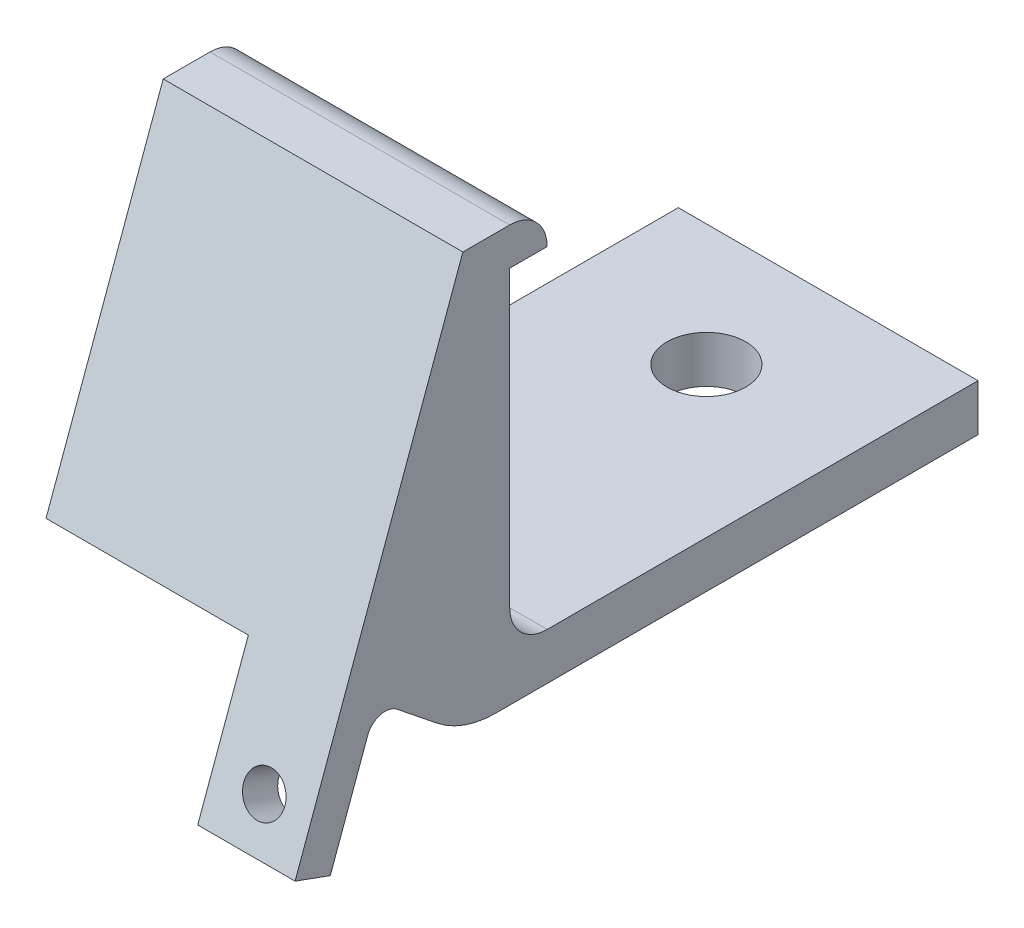
ISO-10303-21;
HEADER;
FILE_DESCRIPTION(('STEP AP214'),'2;1');
FILE_NAME('part.step','',(''),(''),'','','');
FILE_SCHEMA(('AUTOMOTIVE_DESIGN { 1 0 10303 214 1 1 1 1 }'));
ENDSEC;
DATA;
#1=APPLICATION_CONTEXT('core data for automotive mechanical design processes');
#2=APPLICATION_PROTOCOL_DEFINITION('international standard','automotive_design',2000,#1);
#3=PRODUCT_CONTEXT('',#1,'mechanical');
#4=PRODUCT('Part','Part','',(#3));
#5=PRODUCT_RELATED_PRODUCT_CATEGORY('part','',(#4));
#6=PRODUCT_DEFINITION_FORMATION('','',#4);
#7=PRODUCT_DEFINITION_CONTEXT('part definition',#1,'design');
#8=PRODUCT_DEFINITION('design','',#6,#7);
#9=PRODUCT_DEFINITION_SHAPE('','',#8);
#10=(LENGTH_UNIT() NAMED_UNIT(*) SI_UNIT(.MILLI.,.METRE.));
#11=(NAMED_UNIT(*) PLANE_ANGLE_UNIT() SI_UNIT($,.RADIAN.));
#12=(NAMED_UNIT(*) SI_UNIT($,.STERADIAN.) SOLID_ANGLE_UNIT());
#13=UNCERTAINTY_MEASURE_WITH_UNIT(LENGTH_MEASURE(1.E-05),#10,'distance_accuracy_value','');
#14=(GEOMETRIC_REPRESENTATION_CONTEXT(3) GLOBAL_UNCERTAINTY_ASSIGNED_CONTEXT((#13)) GLOBAL_UNIT_ASSIGNED_CONTEXT((#10,
#11,#12)) REPRESENTATION_CONTEXT('',''));
#15=CARTESIAN_POINT('',(0.,0.,0.));
#16=DIRECTION('',(0.,0.,1.));
#17=DIRECTION('',(1.,0.,0.));
#18=AXIS2_PLACEMENT_3D('',#15,#16,#17);
#19=CARTESIAN_POINT('',(39.0645812711874,-1.21992383038549,0.977445697048083));
#20=DIRECTION('',(0.,0.780398437454078,-0.625282559183633));
#21=DIRECTION('',(0.,0.625282559183633,0.780398437454078));
#22=AXIS2_PLACEMENT_3D('',#19,#20,#21);
#23=PLANE('',#22);
#24=DIRECTION('',(0.,-0.625282559183633,-0.780398437454078));
#25=VECTOR('',#24,1.);
#26=CARTESIAN_POINT('',(0.,-1.21992383038549,0.977445697048083));
#27=LINE('',#26,#25);
#28=CARTESIAN_POINT('',(0.,5.01235808238604,8.75579005523743));
#29=VERTEX_POINT('',#28);
#30=CARTESIAN_POINT('',(0.,1.09800781272961,3.87039418224827));
#31=VERTEX_POINT('',#30);
#32=EDGE_CURVE('E195',#29,#31,#27,.T.);
#33=ORIENTED_EDGE('',*,*,#32,.T.);
#34=DIRECTION('',(1.,0.,0.));
#35=VECTOR('',#34,1.);
#36=CARTESIAN_POINT('',(39.0645812711874,1.09800781272961,3.87039418224827));
#37=LINE('',#36,#35);
#38=CARTESIAN_POINT('',(16.,1.09800781272961,3.87039418224827));
#39=VERTEX_POINT('',#38);
#40=EDGE_CURVE('E277',#31,#39,#37,.T.);
#41=ORIENTED_EDGE('',*,*,#40,.T.);
#42=DIRECTION('',(0.,-0.625282559183633,-0.780398437454078));
#43=VECTOR('',#42,1.);
#44=CARTESIAN_POINT('',(16.,-1.21992383038549,0.977445697048083));
#45=LINE('',#44,#43);
#46=CARTESIAN_POINT('',(16.,2.82024967883995,6.01987818990277));
#47=VERTEX_POINT('',#46);
#48=EDGE_CURVE('E198',#47,#39,#45,.T.);
#49=ORIENTED_EDGE('',*,*,#48,.F.);
#50=DIRECTION('',(1.,0.,0.));
#51=VECTOR('',#50,1.);
#52=CARTESIAN_POINT('',(10.80119183,2.82024967883995,6.01987818990277));
#53=LINE('',#52,#51);
#54=CARTESIAN_POINT('',(10.80119183,2.82024967883995,6.01987818990277));
#55=VERTEX_POINT('',#54);
#56=EDGE_CURVE('E271',#47,#55,#53,.F.);
#57=ORIENTED_EDGE('',*,*,#56,.T.);
#58=DIRECTION('',(0.,-0.625282559183633,-0.780398437454078));
#59=VECTOR('',#58,1.);
#60=CARTESIAN_POINT('',(10.80119183,-1.21992383038549,0.977445697048083));
#61=LINE('',#60,#59);
#62=CARTESIAN_POINT('',(10.80119183,5.01235808238604,8.75579005523744));
#63=VERTEX_POINT('',#62);
#64=EDGE_CURVE('E267',#63,#55,#61,.T.);
#65=ORIENTED_EDGE('',*,*,#64,.F.);
#66=DIRECTION('',(-1.,0.,0.));
#67=VECTOR('',#66,1.);
#68=CARTESIAN_POINT('',(39.0645812711874,5.01235808238604,8.75579005523743));
#69=LINE('',#68,#67);
#70=EDGE_CURVE('E189',#63,#29,#69,.T.);
#71=ORIENTED_EDGE('',*,*,#70,.T.);
#72=EDGE_LOOP('',(#33,#41,#49,#57,#65,#71));
#73=FACE_BOUND('',#72,.T.);
#74=ADVANCED_FACE('F45',(#73),#23,.F.);
#75=CARTESIAN_POINT('',(0.,22.2,0.));
#76=DIRECTION('',(0.,0.,1.));
#77=DIRECTION('',(1.,0.,0.));
#78=AXIS2_PLACEMENT_3D('',#75,#76,#77);
#79=PLANE('',#78);
#80=DIRECTION('',(0.,-1.,0.));
#81=VECTOR('',#80,1.);
#82=CARTESIAN_POINT('',(16.,22.2,0.));
#83=LINE('',#82,#81);
#84=CARTESIAN_POINT('',(16.,20.2,0.));
#85=VERTEX_POINT('',#84);
#86=CARTESIAN_POINT('',(16.,4.5,0.));
#87=VERTEX_POINT('',#86);
#88=EDGE_CURVE('E223',#85,#87,#83,.T.);
#89=ORIENTED_EDGE('',*,*,#88,.T.);
#90=DIRECTION('',(-1.,0.,0.));
#91=VECTOR('',#90,1.);
#92=CARTESIAN_POINT('',(0.,4.5,0.));
#93=LINE('',#92,#91);
#94=CARTESIAN_POINT('',(0.,4.5,0.));
#95=VERTEX_POINT('',#94);
#96=EDGE_CURVE('E252',#87,#95,#93,.T.);
#97=ORIENTED_EDGE('',*,*,#96,.T.);
#98=DIRECTION('',(0.,-1.,0.));
#99=VECTOR('',#98,1.);
#100=CARTESIAN_POINT('',(0.,22.2,0.));
#101=LINE('',#100,#99);
#102=CARTESIAN_POINT('',(0.,20.2,0.));
#103=VERTEX_POINT('',#102);
#104=EDGE_CURVE('E220',#103,#95,#101,.T.);
#105=ORIENTED_EDGE('',*,*,#104,.F.);
#106=DIRECTION('',(-1.,0.,0.));
#107=VECTOR('',#106,1.);
#108=CARTESIAN_POINT('',(16.,20.2,0.));
#109=LINE('',#108,#107);
#110=EDGE_CURVE('E200',#85,#103,#109,.T.);
#111=ORIENTED_EDGE('',*,*,#110,.F.);
#112=EDGE_LOOP('',(#89,#97,#105,#111));
#113=FACE_BOUND('',#112,.T.);
#114=ADVANCED_FACE('F307',(#113),#79,.F.);
#115=CARTESIAN_POINT('',(16.,2.5,0.));
#116=DIRECTION('',(1.,0.,0.));
#117=DIRECTION('',(0.,0.,-1.));
#118=AXIS2_PLACEMENT_3D('',#115,#116,#117);
#119=PLANE('',#118);
#120=ORIENTED_EDGE('',*,*,#48,.T.);
#121=CARTESIAN_POINT('',(16.,5.,0.743981386330101));
#122=DIRECTION('',(1.,0.,0.));
#123=DIRECTION('',(0.,0.,-1.));
#124=AXIS2_PLACEMENT_3D('',#121,#122,#123);
#125=CIRCLE('',#124,5.);
#126=CARTESIAN_POINT('',(16.,0.,0.743981386330101));
#127=VERTEX_POINT('',#126);
#128=EDGE_CURVE('E67',#39,#127,#125,.T.);
#129=ORIENTED_EDGE('',*,*,#128,.T.);
#130=DIRECTION('',(0.,0.,1.));
#131=VECTOR('',#130,1.);
#132=CARTESIAN_POINT('',(16.,0.,0.));
#133=LINE('',#132,#131);
#134=CARTESIAN_POINT('',(16.,0.,-25.));
#135=VERTEX_POINT('',#134);
#136=EDGE_CURVE('E242',#135,#127,#133,.T.);
#137=ORIENTED_EDGE('',*,*,#136,.F.);
#138=DIRECTION('',(0.,-1.,0.));
#139=VECTOR('',#138,1.);
#140=CARTESIAN_POINT('',(16.,2.5,-25.));
#141=LINE('',#140,#139);
#142=CARTESIAN_POINT('',(16.,2.5,-25.));
#143=VERTEX_POINT('',#142);
#144=EDGE_CURVE('E250',#143,#135,#141,.T.);
#145=ORIENTED_EDGE('',*,*,#144,.F.);
#146=DIRECTION('',(0.,0.,1.));
#147=VECTOR('',#146,1.);
#148=CARTESIAN_POINT('',(16.,2.5,0.));
#149=LINE('',#148,#147);
#150=CARTESIAN_POINT('',(16.,2.5,-2.));
#151=VERTEX_POINT('',#150);
#152=EDGE_CURVE('E230',#143,#151,#149,.T.);
#153=ORIENTED_EDGE('',*,*,#152,.T.);
#154=CARTESIAN_POINT('',(16.,4.5,-2.));
#155=DIRECTION('',(1.,0.,0.));
#156=DIRECTION('',(0.,0.,-1.));
#157=AXIS2_PLACEMENT_3D('',#154,#155,#156);
#158=CIRCLE('',#157,2.);
#159=EDGE_CURVE('E265',#151,#87,#158,.F.);
#160=ORIENTED_EDGE('',*,*,#159,.T.);
#161=ORIENTED_EDGE('',*,*,#88,.F.);
#162=DIRECTION('',(0.,0.,1.));
#163=VECTOR('',#162,1.);
#164=CARTESIAN_POINT('',(16.,20.2,-2.));
#165=LINE('',#164,#163);
#166=CARTESIAN_POINT('',(16.,20.2,-2.));
#167=VERTEX_POINT('',#166);
#168=EDGE_CURVE('E210',#167,#85,#165,.T.);
#169=ORIENTED_EDGE('',*,*,#168,.F.);
#170=CARTESIAN_POINT('',(16.,20.2,0.));
#171=DIRECTION('',(1.,0.,0.));
#172=DIRECTION('',(0.,0.,-1.));
#173=AXIS2_PLACEMENT_3D('',#170,#171,#172);
#174=CIRCLE('',#173,2.);
#175=CARTESIAN_POINT('',(16.,22.2,0.));
#176=VERTEX_POINT('',#175);
#177=EDGE_CURVE('E257',#167,#176,#174,.T.);
#178=ORIENTED_EDGE('',*,*,#177,.T.);
#179=DIRECTION('',(0.,0.,-1.));
#180=VECTOR('',#179,1.);
#181=CARTESIAN_POINT('',(16.,22.2,0.));
#182=LINE('',#181,#180);
#183=CARTESIAN_POINT('',(16.,22.2,2.5));
#184=VERTEX_POINT('',#183);
#185=EDGE_CURVE('E215',#184,#176,#182,.T.);
#186=ORIENTED_EDGE('',*,*,#185,.F.);
#187=DIRECTION('',(0.,-0.939692620785911,0.342020143325663));
#188=VECTOR('',#187,1.);
#189=CARTESIAN_POINT('',(16.,3.40039119348742,9.34249802141921));
#190=LINE('',#189,#188);
#191=CARTESIAN_POINT('',(16.,-2.41121362182265,11.4577491875102));
#192=VERTEX_POINT('',#191);
#193=EDGE_CURVE('E194',#184,#192,#190,.T.);
#194=ORIENTED_EDGE('',*,*,#193,.T.);
#195=DIRECTION('',(0.,0.342020143325663,0.939692620785911));
#196=VECTOR('',#195,1.);
#197=CARTESIAN_POINT('',(16.,-3.09525390847398,9.57836394593836));
#198=LINE('',#197,#196);
#199=CARTESIAN_POINT('',(16.,-3.09525390847398,9.57836394593836));
#200=VERTEX_POINT('',#199);
#201=EDGE_CURVE('E172',#200,#192,#198,.T.);
#202=ORIENTED_EDGE('',*,*,#201,.F.);
#203=DIRECTION('',(0.,0.93969262078591,-0.342020143325663));
#204=VECTOR('',#203,1.);
#205=CARTESIAN_POINT('',(16.,2.71635090683609,7.4631127798474));
#206=LINE('',#205,#204);
#207=CARTESIAN_POINT('',(16.,2.38187138471153,7.58485336987232));
#208=VERTEX_POINT('',#207);
#209=EDGE_CURVE('E160',#200,#208,#206,.T.);
#210=ORIENTED_EDGE('',*,*,#209,.T.);
#211=CARTESIAN_POINT('',(16.,2.03985124138587,6.64516074908641));
#212=DIRECTION('',(1.,0.,0.));
#213=DIRECTION('',(0.,0.,-1.));
#214=AXIS2_PLACEMENT_3D('',#211,#212,#213);
#215=CIRCLE('',#214,1.);
#216=EDGE_CURVE('E274',#208,#47,#215,.F.);
#217=ORIENTED_EDGE('',*,*,#216,.T.);
#218=EDGE_LOOP('',(#120,#129,#137,#145,#153,#160,#161,#169,#178,#186,#194,#202,#210,#217));
#219=FACE_BOUND('',#218,.T.);
#220=ADVANCED_FACE('F287',(#219),#119,.T.);
#221=CARTESIAN_POINT('',(0.,2.5,-25.));
#222=DIRECTION('',(0.,0.,-1.));
#223=DIRECTION('',(-1.,0.,0.));
#224=AXIS2_PLACEMENT_3D('',#221,#222,#223);
#225=PLANE('',#224);
#226=DIRECTION('',(1.,0.,0.));
#227=VECTOR('',#226,1.);
#228=CARTESIAN_POINT('',(0.,0.,-25.));
#229=LINE('',#228,#227);
#230=CARTESIAN_POINT('',(0.,0.,-25.));
#231=VERTEX_POINT('',#230);
#232=EDGE_CURVE('E244',#231,#135,#229,.T.);
#233=ORIENTED_EDGE('',*,*,#232,.F.);
#234=DIRECTION('',(0.,-1.,0.));
#235=VECTOR('',#234,1.);
#236=CARTESIAN_POINT('',(0.,2.5,-25.));
#237=LINE('',#236,#235);
#238=CARTESIAN_POINT('',(0.,2.5,-25.));
#239=VERTEX_POINT('',#238);
#240=EDGE_CURVE('E239',#239,#231,#237,.T.);
#241=ORIENTED_EDGE('',*,*,#240,.F.);
#242=DIRECTION('',(1.,0.,0.));
#243=VECTOR('',#242,1.);
#244=CARTESIAN_POINT('',(0.,2.5,-25.));
#245=LINE('',#244,#243);
#246=EDGE_CURVE('E234',#239,#143,#245,.T.);
#247=ORIENTED_EDGE('',*,*,#246,.T.);
#248=ORIENTED_EDGE('',*,*,#144,.T.);
#249=EDGE_LOOP('',(#233,#241,#247,#248));
#250=FACE_BOUND('',#249,.T.);
#251=ADVANCED_FACE('F336',(#250),#225,.T.);
#252=CARTESIAN_POINT('',(8.,2.5,-18.5));
#253=DIRECTION('',(0.,-1.,0.));
#254=DIRECTION('',(0.,0.,-1.));
#255=AXIS2_PLACEMENT_3D('',#252,#253,#254);
#256=CYLINDRICAL_SURFACE('',#255,2.1);
#257=CARTESIAN_POINT('',(8.,2.5,-18.5));
#258=DIRECTION('',(0.,1.,0.));
#259=DIRECTION('',(0.,0.,1.));
#260=AXIS2_PLACEMENT_3D('',#257,#258,#259);
#261=CIRCLE('',#260,2.1);
#262=CARTESIAN_POINT('',(8.,2.5,-16.4));
#263=VERTEX_POINT('',#262);
#264=EDGE_CURVE('E227',#263,#263,#261,.T.);
#265=ORIENTED_EDGE('',*,*,#264,.T.);
#266=EDGE_LOOP('',(#265));
#267=FACE_BOUND('',#266,.T.);
#268=CARTESIAN_POINT('',(8.,0.,-18.5));
#269=DIRECTION('',(0.,1.,0.));
#270=DIRECTION('',(0.,0.,1.));
#271=AXIS2_PLACEMENT_3D('',#268,#269,#270);
#272=CIRCLE('',#271,2.1);
#273=CARTESIAN_POINT('',(8.,0.,-16.4));
#274=VERTEX_POINT('',#273);
#275=EDGE_CURVE('E226',#274,#274,#272,.T.);
#276=ORIENTED_EDGE('',*,*,#275,.F.);
#277=EDGE_LOOP('',(#276));
#278=FACE_BOUND('',#277,.T.);
#279=ADVANCED_FACE('F335',(#267,#278),#256,.F.);
#280=CARTESIAN_POINT('',(0.,2.5,0.));
#281=DIRECTION('',(-1.,0.,0.));
#282=DIRECTION('',(0.,0.,1.));
#283=AXIS2_PLACEMENT_3D('',#280,#281,#282);
#284=PLANE('',#283);
#285=DIRECTION('',(0.,0.,-1.));
#286=VECTOR('',#285,1.);
#287=CARTESIAN_POINT('',(0.,0.,0.));
#288=LINE('',#287,#286);
#289=CARTESIAN_POINT('',(0.,0.,0.743981386330101));
#290=VERTEX_POINT('',#289);
#291=EDGE_CURVE('E231',#290,#231,#288,.T.);
#292=ORIENTED_EDGE('',*,*,#291,.F.);
#293=CARTESIAN_POINT('',(0.,5.,0.743981386330101));
#294=DIRECTION('',(-1.,0.,0.));
#295=DIRECTION('',(0.,0.,1.));
#296=AXIS2_PLACEMENT_3D('',#293,#294,#295);
#297=CIRCLE('',#296,5.);
#298=EDGE_CURVE('E11',#290,#31,#297,.T.);
#299=ORIENTED_EDGE('',*,*,#298,.T.);
#300=ORIENTED_EDGE('',*,*,#32,.F.);
#301=DIRECTION('',(0.,-0.939692620785911,0.342020143325663));
#302=VECTOR('',#301,1.);
#303=CARTESIAN_POINT('',(0.,3.40039119348742,9.34249802141921));
#304=LINE('',#303,#302);
#305=CARTESIAN_POINT('',(0.,22.2,2.5));
#306=VERTEX_POINT('',#305);
#307=EDGE_CURVE('E191',#306,#29,#304,.T.);
#308=ORIENTED_EDGE('',*,*,#307,.F.);
#309=DIRECTION('',(0.,0.,1.));
#310=VECTOR('',#309,1.);
#311=CARTESIAN_POINT('',(0.,22.2,0.));
#312=LINE('',#311,#310);
#313=CARTESIAN_POINT('',(0.,22.2,0.));
#314=VERTEX_POINT('',#313);
#315=EDGE_CURVE('E218',#314,#306,#312,.T.);
#316=ORIENTED_EDGE('',*,*,#315,.F.);
#317=CARTESIAN_POINT('',(0.,20.2,0.));
#318=DIRECTION('',(-1.,0.,0.));
#319=DIRECTION('',(0.,0.,1.));
#320=AXIS2_PLACEMENT_3D('',#317,#318,#319);
#321=CIRCLE('',#320,2.);
#322=CARTESIAN_POINT('',(0.,20.2,-2.));
#323=VERTEX_POINT('',#322);
#324=EDGE_CURVE('E261',#314,#323,#321,.T.);
#325=ORIENTED_EDGE('',*,*,#324,.T.);
#326=DIRECTION('',(0.,0.,1.));
#327=VECTOR('',#326,1.);
#328=CARTESIAN_POINT('',(0.,20.2,-2.));
#329=LINE('',#328,#327);
#330=EDGE_CURVE('E206',#323,#103,#329,.T.);
#331=ORIENTED_EDGE('',*,*,#330,.T.);
#332=ORIENTED_EDGE('',*,*,#104,.T.);
#333=CARTESIAN_POINT('',(0.,4.5,-2.));
#334=DIRECTION('',(-1.,0.,0.));
#335=DIRECTION('',(0.,0.,1.));
#336=AXIS2_PLACEMENT_3D('',#333,#334,#335);
#337=CIRCLE('',#336,2.);
#338=CARTESIAN_POINT('',(0.,2.5,-2.));
#339=VERTEX_POINT('',#338);
#340=EDGE_CURVE('E263',#95,#339,#337,.F.);
#341=ORIENTED_EDGE('',*,*,#340,.T.);
#342=DIRECTION('',(0.,0.,-1.));
#343=VECTOR('',#342,1.);
#344=CARTESIAN_POINT('',(0.,2.5,0.));
#345=LINE('',#344,#343);
#346=EDGE_CURVE('E237',#339,#239,#345,.T.);
#347=ORIENTED_EDGE('',*,*,#346,.T.);
#348=ORIENTED_EDGE('',*,*,#240,.T.);
#349=EDGE_LOOP('',(#292,#299,#300,#308,#316,#325,#331,#332,#341,#347,#348));
#350=FACE_BOUND('',#349,.T.);
#351=ADVANCED_FACE('F299',(#350),#284,.T.);
#352=CARTESIAN_POINT('',(0.,2.5,0.));
#353=DIRECTION('',(0.,1.,0.));
#354=DIRECTION('',(0.,0.,1.));
#355=AXIS2_PLACEMENT_3D('',#352,#353,#354);
#356=PLANE('',#355);
#357=ORIENTED_EDGE('',*,*,#264,.F.);
#358=EDGE_LOOP('',(#357));
#359=FACE_BOUND('',#358,.T.);
#360=ORIENTED_EDGE('',*,*,#346,.F.);
#361=DIRECTION('',(-1.,0.,0.));
#362=VECTOR('',#361,1.);
#363=CARTESIAN_POINT('',(0.,2.5,-2.));
#364=LINE('',#363,#362);
#365=EDGE_CURVE('E255',#339,#151,#364,.F.);
#366=ORIENTED_EDGE('',*,*,#365,.T.);
#367=ORIENTED_EDGE('',*,*,#152,.F.);
#368=ORIENTED_EDGE('',*,*,#246,.F.);
#369=EDGE_LOOP('',(#360,#366,#367,#368));
#370=FACE_BOUND('',#369,.T.);
#371=ADVANCED_FACE('F327',(#359,#370),#356,.T.);
#372=CARTESIAN_POINT('',(0.,0.,0.));
#373=DIRECTION('',(0.,1.,0.));
#374=DIRECTION('',(0.,0.,1.));
#375=AXIS2_PLACEMENT_3D('',#372,#373,#374);
#376=PLANE('',#375);
#377=ORIENTED_EDGE('',*,*,#275,.T.);
#378=EDGE_LOOP('',(#377));
#379=FACE_BOUND('',#378,.T.);
#380=ORIENTED_EDGE('',*,*,#136,.T.);
#381=DIRECTION('',(1.,0.,0.));
#382=VECTOR('',#381,1.);
#383=CARTESIAN_POINT('',(0.,0.,0.743981386330101));
#384=LINE('',#383,#382);
#385=EDGE_CURVE('E53',#127,#290,#384,.F.);
#386=ORIENTED_EDGE('',*,*,#385,.T.);
#387=ORIENTED_EDGE('',*,*,#291,.T.);
#388=ORIENTED_EDGE('',*,*,#232,.T.);
#389=EDGE_LOOP('',(#380,#386,#387,#388));
#390=FACE_BOUND('',#389,.T.);
#391=ADVANCED_FACE('F324',(#379,#390),#376,.F.);
#392=CARTESIAN_POINT('',(0.,22.2,0.));
#393=DIRECTION('',(0.,1.,0.));
#394=DIRECTION('',(0.,0.,1.));
#395=AXIS2_PLACEMENT_3D('',#392,#393,#394);
#396=PLANE('',#395);
#397=ORIENTED_EDGE('',*,*,#185,.T.);
#398=DIRECTION('',(1.,0.,0.));
#399=VECTOR('',#398,1.);
#400=CARTESIAN_POINT('',(0.,22.2,0.));
#401=LINE('',#400,#399);
#402=EDGE_CURVE('E259',#176,#314,#401,.F.);
#403=ORIENTED_EDGE('',*,*,#402,.T.);
#404=ORIENTED_EDGE('',*,*,#315,.T.);
#405=DIRECTION('',(1.,0.,0.));
#406=VECTOR('',#405,1.);
#407=CARTESIAN_POINT('',(0.,22.2,2.5));
#408=LINE('',#407,#406);
#409=EDGE_CURVE('E212',#306,#184,#408,.T.);
#410=ORIENTED_EDGE('',*,*,#409,.T.);
#411=EDGE_LOOP('',(#397,#403,#404,#410));
#412=FACE_BOUND('',#411,.T.);
#413=ADVANCED_FACE('F321',(#412),#396,.T.);
#414=CARTESIAN_POINT('',(16.,20.2,-2.));
#415=DIRECTION('',(0.,1.,0.));
#416=DIRECTION('',(0.,0.,1.));
#417=AXIS2_PLACEMENT_3D('',#414,#415,#416);
#418=PLANE('',#417);
#419=ORIENTED_EDGE('',*,*,#110,.T.);
#420=ORIENTED_EDGE('',*,*,#330,.F.);
#421=DIRECTION('',(-1.,0.,0.));
#422=VECTOR('',#421,1.);
#423=CARTESIAN_POINT('',(16.,20.2,-2.));
#424=LINE('',#423,#422);
#425=EDGE_CURVE('E203',#167,#323,#424,.T.);
#426=ORIENTED_EDGE('',*,*,#425,.F.);
#427=ORIENTED_EDGE('',*,*,#168,.T.);
#428=EDGE_LOOP('',(#419,#420,#426,#427));
#429=FACE_BOUND('',#428,.T.);
#430=ADVANCED_FACE('F318',(#429),#418,.F.);
#431=CARTESIAN_POINT('',(39.0645812711874,3.40039119348742,9.34249802141921));
#432=DIRECTION('',(0.,-0.342020143325663,-0.939692620785911));
#433=DIRECTION('',(0.,0.939692620785911,-0.342020143325663));
#434=AXIS2_PLACEMENT_3D('',#431,#432,#433);
#435=PLANE('',#434);
#436=ORIENTED_EDGE('',*,*,#193,.F.);
#437=ORIENTED_EDGE('',*,*,#409,.F.);
#438=ORIENTED_EDGE('',*,*,#307,.T.);
#439=ORIENTED_EDGE('',*,*,#70,.F.);
#440=DIRECTION('',(0.,0.93969262078591,-0.342020143325663));
#441=VECTOR('',#440,1.);
#442=CARTESIAN_POINT('',(10.80119183,3.40039119348742,9.34249802141922));
#443=LINE('',#442,#441);
#444=CARTESIAN_POINT('',(10.80119183,-2.41121362182265,11.4577491875102));
#445=VERTEX_POINT('',#444);
#446=EDGE_CURVE('E186',#445,#63,#443,.T.);
#447=ORIENTED_EDGE('',*,*,#446,.F.);
#448=DIRECTION('',(-1.,0.,0.));
#449=VECTOR('',#448,1.);
#450=CARTESIAN_POINT('',(0.,-2.41121362182265,11.4577491875102));
#451=LINE('',#450,#449);
#452=EDGE_CURVE('E168',#192,#445,#451,.T.);
#453=ORIENTED_EDGE('',*,*,#452,.F.);
#454=EDGE_LOOP('',(#436,#437,#438,#439,#447,#453));
#455=FACE_BOUND('',#454,.T.);
#456=CARTESIAN_POINT('',(13.5,-0.0619820698578777,10.602698829196));
#457=DIRECTION('',(0.,0.342020143325663,0.93969262078591));
#458=DIRECTION('',(0.,-0.93969262078591,0.342020143325663));
#459=AXIS2_PLACEMENT_3D('',#456,#457,#458);
#460=CIRCLE('',#459,1.1);
#461=CARTESIAN_POINT('',(13.5,-1.09564395272238,10.9789209868542));
#462=VERTEX_POINT('',#461);
#463=EDGE_CURVE('E178',#462,#462,#460,.T.);
#464=ORIENTED_EDGE('',*,*,#463,.F.);
#465=EDGE_LOOP('',(#464));
#466=FACE_BOUND('',#465,.T.);
#467=ADVANCED_FACE('F293',(#455,#466),#435,.F.);
#468=CARTESIAN_POINT('',(0.,4.5,-2.));
#469=DIRECTION('',(-1.,0.,0.));
#470=DIRECTION('',(0.,0.,1.));
#471=AXIS2_PLACEMENT_3D('',#468,#469,#470);
#472=CYLINDRICAL_SURFACE('',#471,2.);
#473=ORIENTED_EDGE('',*,*,#159,.F.);
#474=ORIENTED_EDGE('',*,*,#365,.F.);
#475=ORIENTED_EDGE('',*,*,#340,.F.);
#476=ORIENTED_EDGE('',*,*,#96,.F.);
#477=EDGE_LOOP('',(#473,#474,#475,#476));
#478=FACE_BOUND('',#477,.T.);
#479=ADVANCED_FACE('F344',(#478),#472,.F.);
#480=CARTESIAN_POINT('',(0.,20.2,0.));
#481=DIRECTION('',(1.,0.,0.));
#482=DIRECTION('',(0.,0.,-1.));
#483=AXIS2_PLACEMENT_3D('',#480,#481,#482);
#484=CYLINDRICAL_SURFACE('',#483,2.);
#485=ORIENTED_EDGE('',*,*,#324,.F.);
#486=ORIENTED_EDGE('',*,*,#402,.F.);
#487=ORIENTED_EDGE('',*,*,#177,.F.);
#488=ORIENTED_EDGE('',*,*,#425,.T.);
#489=EDGE_LOOP('',(#485,#486,#487,#488));
#490=FACE_BOUND('',#489,.T.);
#491=ADVANCED_FACE('F347',(#490),#484,.T.);
#492=CARTESIAN_POINT('',(10.80119183,2.71635090683609,7.4631127798474));
#493=DIRECTION('',(1.,0.,0.));
#494=DIRECTION('',(0.,0.,-1.));
#495=AXIS2_PLACEMENT_3D('',#492,#493,#494);
#496=PLANE('',#495);
#497=ORIENTED_EDGE('',*,*,#446,.T.);
#498=ORIENTED_EDGE('',*,*,#64,.T.);
#499=CARTESIAN_POINT('',(10.80119183,2.03985124138587,6.64516074908641));
#500=DIRECTION('',(1.,0.,0.));
#501=DIRECTION('',(0.,0.,-1.));
#502=AXIS2_PLACEMENT_3D('',#499,#500,#501);
#503=CIRCLE('',#502,1.);
#504=CARTESIAN_POINT('',(10.80119183,2.38187138471153,7.58485336987232));
#505=VERTEX_POINT('',#504);
#506=EDGE_CURVE('E177',#55,#505,#503,.T.);
#507=ORIENTED_EDGE('',*,*,#506,.T.);
#508=DIRECTION('',(0.,0.93969262078591,-0.342020143325663));
#509=VECTOR('',#508,1.);
#510=CARTESIAN_POINT('',(10.80119183,2.71635090683609,7.4631127798474));
#511=LINE('',#510,#509);
#512=CARTESIAN_POINT('',(10.80119183,-3.09525390847398,9.57836394593835));
#513=VERTEX_POINT('',#512);
#514=EDGE_CURVE('E157',#513,#505,#511,.T.);
#515=ORIENTED_EDGE('',*,*,#514,.F.);
#516=DIRECTION('',(0.,0.342020143325663,0.939692620785911));
#517=VECTOR('',#516,1.);
#518=CARTESIAN_POINT('',(10.80119183,-3.09525390847398,9.57836394593835));
#519=LINE('',#518,#517);
#520=EDGE_CURVE('E165',#513,#445,#519,.T.);
#521=ORIENTED_EDGE('',*,*,#520,.T.);
#522=EDGE_LOOP('',(#497,#498,#507,#515,#521));
#523=FACE_BOUND('',#522,.T.);
#524=ADVANCED_FACE('F175',(#523),#496,.F.);
#525=CARTESIAN_POINT('',(0.,2.71635090683609,7.4631127798474));
#526=DIRECTION('',(0.,0.342020143325663,0.93969262078591));
#527=DIRECTION('',(0.,-0.93969262078591,0.342020143325663));
#528=AXIS2_PLACEMENT_3D('',#525,#526,#527);
#529=PLANE('',#528);
#530=CARTESIAN_POINT('',(13.5,-0.746022356509204,8.72331358762419));
#531=DIRECTION('',(0.,0.342020143325663,0.93969262078591));
#532=DIRECTION('',(0.,-0.93969262078591,0.342020143325663));
#533=AXIS2_PLACEMENT_3D('',#530,#531,#532);
#534=CIRCLE('',#533,1.1);
#535=CARTESIAN_POINT('',(13.5,-1.77968423937371,9.09953574528242));
#536=VERTEX_POINT('',#535);
#537=EDGE_CURVE('E173',#536,#536,#534,.T.);
#538=ORIENTED_EDGE('',*,*,#537,.T.);
#539=EDGE_LOOP('',(#538));
#540=FACE_BOUND('',#539,.T.);
#541=ORIENTED_EDGE('',*,*,#514,.T.);
#542=DIRECTION('',(1.,0.,0.));
#543=VECTOR('',#542,1.);
#544=CARTESIAN_POINT('',(16.,2.38187138471153,7.58485336987232));
#545=LINE('',#544,#543);
#546=EDGE_CURVE('E269',#505,#208,#545,.T.);
#547=ORIENTED_EDGE('',*,*,#546,.T.);
#548=ORIENTED_EDGE('',*,*,#209,.F.);
#549=DIRECTION('',(-1.,0.,0.));
#550=VECTOR('',#549,1.);
#551=CARTESIAN_POINT('',(0.,-3.09525390847398,9.57836394593835));
#552=LINE('',#551,#550);
#553=EDGE_CURVE('E152',#200,#513,#552,.T.);
#554=ORIENTED_EDGE('',*,*,#553,.T.);
#555=EDGE_LOOP('',(#541,#547,#548,#554));
#556=FACE_BOUND('',#555,.T.);
#557=ADVANCED_FACE('F154',(#540,#556),#529,.F.);
#558=CARTESIAN_POINT('',(0.,-3.09525390847398,9.57836394593835));
#559=DIRECTION('',(0.,0.939692620785911,-0.342020143325663));
#560=DIRECTION('',(0.,0.342020143325663,0.939692620785911));
#561=AXIS2_PLACEMENT_3D('',#558,#559,#560);
#562=PLANE('',#561);
#563=ORIENTED_EDGE('',*,*,#452,.T.);
#564=ORIENTED_EDGE('',*,*,#520,.F.);
#565=ORIENTED_EDGE('',*,*,#553,.F.);
#566=ORIENTED_EDGE('',*,*,#201,.T.);
#567=EDGE_LOOP('',(#563,#564,#565,#566));
#568=FACE_BOUND('',#567,.T.);
#569=ADVANCED_FACE('F166',(#568),#562,.F.);
#570=CARTESIAN_POINT('',(13.5,-0.746022356509204,8.72331358762419));
#571=DIRECTION('',(0.,0.342020143325663,0.939692620785911));
#572=DIRECTION('',(0.,-0.939692620785911,0.342020143325663));
#573=AXIS2_PLACEMENT_3D('',#570,#571,#572);
#574=CYLINDRICAL_SURFACE('',#573,1.1);
#575=ORIENTED_EDGE('',*,*,#537,.F.);
#576=EDGE_LOOP('',(#575));
#577=FACE_BOUND('',#576,.T.);
#578=ORIENTED_EDGE('',*,*,#463,.T.);
#579=EDGE_LOOP('',(#578));
#580=FACE_BOUND('',#579,.T.);
#581=ADVANCED_FACE('F305',(#577,#580),#574,.F.);
#582=CARTESIAN_POINT('',(0.,2.03985124138587,6.64516074908641));
#583=DIRECTION('',(-1.,0.,0.));
#584=DIRECTION('',(0.,0.,1.));
#585=AXIS2_PLACEMENT_3D('',#582,#583,#584);
#586=CYLINDRICAL_SURFACE('',#585,1.);
#587=ORIENTED_EDGE('',*,*,#506,.F.);
#588=ORIENTED_EDGE('',*,*,#56,.F.);
#589=ORIENTED_EDGE('',*,*,#216,.F.);
#590=ORIENTED_EDGE('',*,*,#546,.F.);
#591=EDGE_LOOP('',(#587,#588,#589,#590));
#592=FACE_BOUND('',#591,.T.);
#593=ADVANCED_FACE('F289',(#592),#586,.F.);
#594=CARTESIAN_POINT('',(39.0645812711874,5.,0.743981386330101));
#595=DIRECTION('',(1.,0.,0.));
#596=DIRECTION('',(0.,0.,-1.));
#597=AXIS2_PLACEMENT_3D('',#594,#595,#596);
#598=CYLINDRICAL_SURFACE('',#597,5.);
#599=ORIENTED_EDGE('',*,*,#298,.F.);
#600=ORIENTED_EDGE('',*,*,#385,.F.);
#601=ORIENTED_EDGE('',*,*,#128,.F.);
#602=ORIENTED_EDGE('',*,*,#40,.F.);
#603=EDGE_LOOP('',(#599,#600,#601,#602));
#604=FACE_BOUND('',#603,.T.);
#605=ADVANCED_FACE('F47',(#604),#598,.T.);
#606=CLOSED_SHELL('',(#74,#114,#220,#251,#279,#351,#371,#391,#413,#430,#467,#479,#491,#524,#557,
#569,#581,#593,#605));
#607=MANIFOLD_SOLID_BREP('B2',#606);
#608=ADVANCED_BREP_SHAPE_REPRESENTATION('',(#18,#607),#14);
#609=SHAPE_DEFINITION_REPRESENTATION(#9,#608);
ENDSEC;
END-ISO-10303-21;
